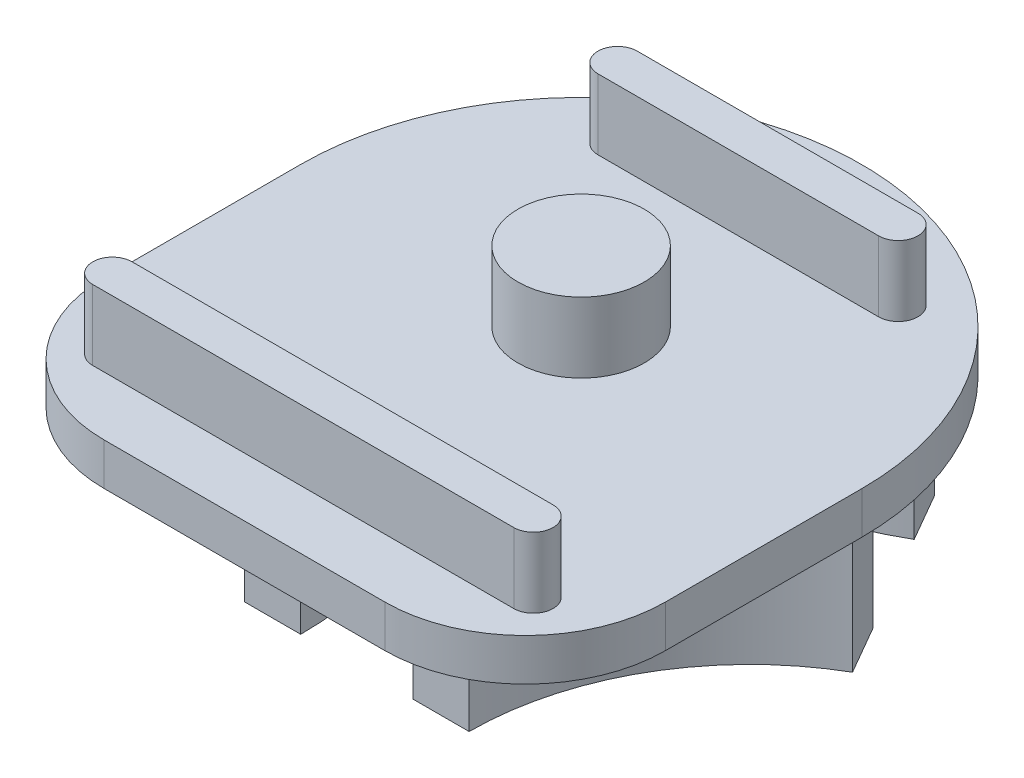
ISO-10303-21;
HEADER;
FILE_DESCRIPTION(('STEP AP214'),'2;1');
FILE_NAME('part.step','',(''),(''),'','','');
FILE_SCHEMA(('AUTOMOTIVE_DESIGN { 1 0 10303 214 1 1 1 1 }'));
ENDSEC;
DATA;
#1=APPLICATION_CONTEXT('core data for automotive mechanical design processes');
#2=APPLICATION_PROTOCOL_DEFINITION('international standard','automotive_design',2000,#1);
#3=PRODUCT_CONTEXT('',#1,'mechanical');
#4=PRODUCT('Part','Part','',(#3));
#5=PRODUCT_RELATED_PRODUCT_CATEGORY('part','',(#4));
#6=PRODUCT_DEFINITION_FORMATION('','',#4);
#7=PRODUCT_DEFINITION_CONTEXT('part definition',#1,'design');
#8=PRODUCT_DEFINITION('design','',#6,#7);
#9=PRODUCT_DEFINITION_SHAPE('','',#8);
#10=(LENGTH_UNIT() NAMED_UNIT(*) SI_UNIT(.MILLI.,.METRE.));
#11=(NAMED_UNIT(*) PLANE_ANGLE_UNIT() SI_UNIT($,.RADIAN.));
#12=(NAMED_UNIT(*) SI_UNIT($,.STERADIAN.) SOLID_ANGLE_UNIT());
#13=UNCERTAINTY_MEASURE_WITH_UNIT(LENGTH_MEASURE(1.E-05),#10,'distance_accuracy_value','');
#14=(GEOMETRIC_REPRESENTATION_CONTEXT(3) GLOBAL_UNCERTAINTY_ASSIGNED_CONTEXT((#13)) GLOBAL_UNIT_ASSIGNED_CONTEXT((#10,
#11,#12)) REPRESENTATION_CONTEXT('',''));
#15=CARTESIAN_POINT('',(0.,0.,0.));
#16=DIRECTION('',(0.,0.,1.));
#17=DIRECTION('',(1.,0.,0.));
#18=AXIS2_PLACEMENT_3D('',#15,#16,#17);
#19=CARTESIAN_POINT('',(0.,13.,32.5169500241013));
#20=DIRECTION('',(0.,1.,0.));
#21=DIRECTION('',(0.,0.,1.));
#22=AXIS2_PLACEMENT_3D('',#19,#20,#21);
#23=PLANE('',#22);
#24=CARTESIAN_POINT('',(0.,13.,32.5169500241013));
#25=DIRECTION('',(0.,1.,0.));
#26=DIRECTION('',(0.,0.,1.));
#27=AXIS2_PLACEMENT_3D('',#24,#25,#26);
#28=CIRCLE('',#27,4.5);
#29=CARTESIAN_POINT('',(0.,13.,37.0169500241013));
#30=VERTEX_POINT('',#29);
#31=EDGE_CURVE('E315',#30,#30,#28,.T.);
#32=ORIENTED_EDGE('',*,*,#31,.F.);
#33=EDGE_LOOP('',(#32));
#34=FACE_BOUND('',#33,.T.);
#35=DIRECTION('',(0.,0.,1.));
#36=VECTOR('',#35,1.);
#37=CARTESIAN_POINT('',(-20.,13.,32.5169500241013));
#38=LINE('',#37,#36);
#39=CARTESIAN_POINT('',(-20.,13.,32.5169500241013));
#40=VERTEX_POINT('',#39);
#41=CARTESIAN_POINT('',(-20.,13.,46.5059222746521));
#42=VERTEX_POINT('',#41);
#43=EDGE_CURVE('E419',#40,#42,#38,.T.);
#44=ORIENTED_EDGE('',*,*,#43,.T.);
#45=CARTESIAN_POINT('',(-10.,13.,46.5059222746521));
#46=DIRECTION('',(0.,1.,0.));
#47=DIRECTION('',(0.,0.,1.));
#48=AXIS2_PLACEMENT_3D('',#45,#46,#47);
#49=CIRCLE('',#48,10.);
#50=CARTESIAN_POINT('',(-10.,13.,56.5059222746521));
#51=VERTEX_POINT('',#50);
#52=EDGE_CURVE('E67',#42,#51,#49,.T.);
#53=ORIENTED_EDGE('',*,*,#52,.T.);
#54=DIRECTION('',(1.,0.,0.));
#55=VECTOR('',#54,1.);
#56=CARTESIAN_POINT('',(-20.,13.,56.5059222746521));
#57=LINE('',#56,#55);
#58=CARTESIAN_POINT('',(9.99999999999999,13.,56.5059222746521));
#59=VERTEX_POINT('',#58);
#60=EDGE_CURVE('E422',#51,#59,#57,.T.);
#61=ORIENTED_EDGE('',*,*,#60,.T.);
#62=CARTESIAN_POINT('',(10.,13.,46.5059222746521));
#63=DIRECTION('',(0.,1.,0.));
#64=DIRECTION('',(0.,0.,1.));
#65=AXIS2_PLACEMENT_3D('',#62,#63,#64);
#66=CIRCLE('',#65,10.);
#67=CARTESIAN_POINT('',(20.,13.,46.5059222746521));
#68=VERTEX_POINT('',#67);
#69=EDGE_CURVE('E74',#59,#68,#66,.T.);
#70=ORIENTED_EDGE('',*,*,#69,.T.);
#71=DIRECTION('',(0.,0.,-1.));
#72=VECTOR('',#71,1.);
#73=CARTESIAN_POINT('',(20.,13.,56.5059222746521));
#74=LINE('',#73,#72);
#75=CARTESIAN_POINT('',(20.,13.,32.5169500241013));
#76=VERTEX_POINT('',#75);
#77=EDGE_CURVE('E424',#68,#76,#74,.T.);
#78=ORIENTED_EDGE('',*,*,#77,.T.);
#79=CARTESIAN_POINT('',(0.,13.,32.5169500241013));
#80=DIRECTION('',(0.,1.,0.));
#81=DIRECTION('',(0.,0.,1.));
#82=AXIS2_PLACEMENT_3D('',#79,#80,#81);
#83=CIRCLE('',#82,20.);
#84=EDGE_CURVE('E416',#76,#40,#83,.T.);
#85=ORIENTED_EDGE('',*,*,#84,.T.);
#86=EDGE_LOOP('',(#44,#53,#61,#70,#78,#85));
#87=FACE_BOUND('',#86,.T.);
#88=DIRECTION('',(1.,0.,0.));
#89=VECTOR('',#88,1.);
#90=CARTESIAN_POINT('',(-10.,13.,21.3169500241013));
#91=LINE('',#90,#89);
#92=CARTESIAN_POINT('',(-10.,13.,21.3169500241013));
#93=VERTEX_POINT('',#92);
#94=CARTESIAN_POINT('',(10.,13.,21.3169500241013));
#95=VERTEX_POINT('',#94);
#96=EDGE_CURVE('E280',#93,#95,#91,.T.);
#97=ORIENTED_EDGE('',*,*,#96,.F.);
#98=CARTESIAN_POINT('',(-10.,13.,19.9169500241013));
#99=DIRECTION('',(0.,1.,0.));
#100=DIRECTION('',(0.,0.,1.));
#101=AXIS2_PLACEMENT_3D('',#98,#99,#100);
#102=CIRCLE('',#101,1.4);
#103=CARTESIAN_POINT('',(-10.,13.,18.5169500241013));
#104=VERTEX_POINT('',#103);
#105=EDGE_CURVE('E277',#104,#93,#102,.T.);
#106=ORIENTED_EDGE('',*,*,#105,.F.);
#107=DIRECTION('',(-1.,0.,0.));
#108=VECTOR('',#107,1.);
#109=CARTESIAN_POINT('',(-10.,13.,18.5169500241013));
#110=LINE('',#109,#108);
#111=CARTESIAN_POINT('',(10.,13.,18.5169500241013));
#112=VERTEX_POINT('',#111);
#113=EDGE_CURVE('E290',#112,#104,#110,.T.);
#114=ORIENTED_EDGE('',*,*,#113,.F.);
#115=CARTESIAN_POINT('',(10.,13.,19.9169500241013));
#116=DIRECTION('',(0.,1.,0.));
#117=DIRECTION('',(0.,0.,1.));
#118=AXIS2_PLACEMENT_3D('',#115,#116,#117);
#119=CIRCLE('',#118,1.4);
#120=EDGE_CURVE('E298',#95,#112,#119,.T.);
#121=ORIENTED_EDGE('',*,*,#120,.F.);
#122=EDGE_LOOP('',(#97,#106,#114,#121));
#123=FACE_BOUND('',#122,.T.);
#124=DIRECTION('',(1.,0.,0.));
#125=VECTOR('',#124,1.);
#126=CARTESIAN_POINT('',(-15.,13.,52.3169500241013));
#127=LINE('',#126,#125);
#128=CARTESIAN_POINT('',(-15.,13.,52.3169500241013));
#129=VERTEX_POINT('',#128);
#130=CARTESIAN_POINT('',(15.,13.,52.3169500241013));
#131=VERTEX_POINT('',#130);
#132=EDGE_CURVE('E889',#129,#131,#127,.T.);
#133=ORIENTED_EDGE('',*,*,#132,.F.);
#134=CARTESIAN_POINT('',(-15.,13.,50.9169500241013));
#135=DIRECTION('',(0.,1.,0.));
#136=DIRECTION('',(0.,0.,1.));
#137=AXIS2_PLACEMENT_3D('',#134,#135,#136);
#138=CIRCLE('',#137,1.39999999999999);
#139=CARTESIAN_POINT('',(-15.,13.,49.5169500241013));
#140=VERTEX_POINT('',#139);
#141=EDGE_CURVE('E275',#140,#129,#138,.T.);
#142=ORIENTED_EDGE('',*,*,#141,.F.);
#143=DIRECTION('',(-1.,0.,0.));
#144=VECTOR('',#143,1.);
#145=CARTESIAN_POINT('',(-15.,13.,49.5169500241013));
#146=LINE('',#145,#144);
#147=CARTESIAN_POINT('',(15.,13.,49.5169500241013));
#148=VERTEX_POINT('',#147);
#149=EDGE_CURVE('E271',#148,#140,#146,.T.);
#150=ORIENTED_EDGE('',*,*,#149,.F.);
#151=CARTESIAN_POINT('',(15.,13.,50.9169500241013));
#152=DIRECTION('',(0.,1.,0.));
#153=DIRECTION('',(0.,0.,1.));
#154=AXIS2_PLACEMENT_3D('',#151,#152,#153);
#155=CIRCLE('',#154,1.39999999999999);
#156=EDGE_CURVE('E886',#131,#148,#155,.T.);
#157=ORIENTED_EDGE('',*,*,#156,.F.);
#158=EDGE_LOOP('',(#133,#142,#150,#157));
#159=FACE_BOUND('',#158,.T.);
#160=ADVANCED_FACE('F59',(#34,#87,#123,#159),#23,.T.);
#161=CARTESIAN_POINT('',(-28.,10.,48.4974226119286));
#162=DIRECTION('',(0.,-1.,0.));
#163=DIRECTION('',(0.,0.,-1.));
#164=AXIS2_PLACEMENT_3D('',#161,#162,#163);
#165=CYLINDRICAL_SURFACE('',#164,20.);
#166=CARTESIAN_POINT('',(-28.,10.,48.4974226119286));
#167=DIRECTION('',(0.,1.,0.));
#168=DIRECTION('',(0.,0.,1.));
#169=AXIS2_PLACEMENT_3D('',#166,#167,#168);
#170=CIRCLE('',#169,20.);
#171=CARTESIAN_POINT('',(-7.99999999999999,10.,48.4974226119286));
#172=VERTEX_POINT('',#171);
#173=CARTESIAN_POINT('',(-18.,10.,31.1769145362398));
#174=VERTEX_POINT('',#173);
#175=EDGE_CURVE('E442',#172,#174,#170,.T.);
#176=ORIENTED_EDGE('',*,*,#175,.T.);
#177=DIRECTION('',(0.,-1.,0.));
#178=VECTOR('',#177,1.);
#179=CARTESIAN_POINT('',(-18.,10.,31.1769145362398));
#180=LINE('',#179,#178);
#181=CARTESIAN_POINT('',(-18.,0.,31.1769145362398));
#182=VERTEX_POINT('',#181);
#183=EDGE_CURVE('E365',#174,#182,#180,.T.);
#184=ORIENTED_EDGE('',*,*,#183,.T.);
#185=CARTESIAN_POINT('',(-28.,0.,48.4974226119286));
#186=DIRECTION('',(0.,1.,0.));
#187=DIRECTION('',(0.,0.,1.));
#188=AXIS2_PLACEMENT_3D('',#185,#186,#187);
#189=CIRCLE('',#188,20.);
#190=CARTESIAN_POINT('',(-7.99999999999999,0.,48.4974226119286));
#191=VERTEX_POINT('',#190);
#192=EDGE_CURVE('E441',#191,#182,#189,.T.);
#193=ORIENTED_EDGE('',*,*,#192,.F.);
#194=DIRECTION('',(0.,-1.,0.));
#195=VECTOR('',#194,1.);
#196=CARTESIAN_POINT('',(-8.,10.,48.4974226119286));
#197=LINE('',#196,#195);
#198=EDGE_CURVE('E355',#191,#172,#197,.F.);
#199=ORIENTED_EDGE('',*,*,#198,.T.);
#200=EDGE_LOOP('',(#176,#184,#193,#199));
#201=FACE_BOUND('',#200,.T.);
#202=ADVANCED_FACE('F494',(#201),#165,.F.);
#203=CARTESIAN_POINT('',(-28.,10.,48.4974226119286));
#204=DIRECTION('',(0.,-1.,0.));
#205=DIRECTION('',(0.,0.,-1.));
#206=AXIS2_PLACEMENT_3D('',#203,#204,#205);
#207=CYLINDRICAL_SURFACE('',#206,24.);
#208=DIRECTION('',(0.,-1.,0.));
#209=VECTOR('',#208,1.);
#210=CARTESIAN_POINT('',(-16.,10.,27.712812921102));
#211=LINE('',#210,#209);
#212=CARTESIAN_POINT('',(-16.,10.,27.712812921102));
#213=VERTEX_POINT('',#212);
#214=CARTESIAN_POINT('',(-16.,0.,27.712812921102));
#215=VERTEX_POINT('',#214);
#216=EDGE_CURVE('E363',#213,#215,#211,.T.);
#217=ORIENTED_EDGE('',*,*,#216,.F.);
#218=CARTESIAN_POINT('',(-28.,10.,48.4974226119286));
#219=DIRECTION('',(0.,1.,0.));
#220=DIRECTION('',(0.,0.,1.));
#221=AXIS2_PLACEMENT_3D('',#218,#219,#220);
#222=CIRCLE('',#221,24.);
#223=CARTESIAN_POINT('',(-3.99999999999999,10.,48.4974226119286));
#224=VERTEX_POINT('',#223);
#225=EDGE_CURVE('E434',#224,#213,#222,.T.);
#226=ORIENTED_EDGE('',*,*,#225,.F.);
#227=DIRECTION('',(0.,-1.,0.));
#228=VECTOR('',#227,1.);
#229=CARTESIAN_POINT('',(-4.,10.,48.4974226119286));
#230=LINE('',#229,#228);
#231=CARTESIAN_POINT('',(-3.99999999999999,0.,48.4974226119286));
#232=VERTEX_POINT('',#231);
#233=EDGE_CURVE('E353',#232,#224,#230,.F.);
#234=ORIENTED_EDGE('',*,*,#233,.F.);
#235=CARTESIAN_POINT('',(-28.,0.,48.4974226119286));
#236=DIRECTION('',(0.,1.,0.));
#237=DIRECTION('',(0.,0.,1.));
#238=AXIS2_PLACEMENT_3D('',#235,#236,#237);
#239=CIRCLE('',#238,24.);
#240=EDGE_CURVE('E445',#232,#215,#239,.T.);
#241=ORIENTED_EDGE('',*,*,#240,.T.);
#242=EDGE_LOOP('',(#217,#226,#234,#241));
#243=FACE_BOUND('',#242,.T.);
#244=ADVANCED_FACE('F500',(#243),#207,.T.);
#245=CARTESIAN_POINT('',(0.,0.,0.));
#246=DIRECTION('',(0.,1.,0.));
#247=DIRECTION('',(0.,0.,1.));
#248=AXIS2_PLACEMENT_3D('',#245,#246,#247);
#249=PLANE('',#248);
#250=DIRECTION('',(0.5,0.,-0.866025403784439));
#251=VECTOR('',#250,1.);
#252=CARTESIAN_POINT('',(-28.,0.,48.4974226119286));
#253=LINE('',#252,#251);
#254=EDGE_CURVE('E332',#182,#215,#253,.T.);
#255=ORIENTED_EDGE('',*,*,#254,.T.);
#256=ORIENTED_EDGE('',*,*,#240,.F.);
#257=DIRECTION('',(-1.,0.,0.));
#258=VECTOR('',#257,1.);
#259=CARTESIAN_POINT('',(28.,0.,48.4974226119286));
#260=LINE('',#259,#258);
#261=EDGE_CURVE('E323',#232,#191,#260,.T.);
#262=ORIENTED_EDGE('',*,*,#261,.T.);
#263=ORIENTED_EDGE('',*,*,#192,.T.);
#264=EDGE_LOOP('',(#255,#256,#262,#263));
#265=FACE_BOUND('',#264,.T.);
#266=ADVANCED_FACE('F521',(#265),#249,.F.);
#267=CARTESIAN_POINT('',(0.,10.,0.));
#268=DIRECTION('',(0.,-1.,0.));
#269=DIRECTION('',(0.,0.,-1.));
#270=AXIS2_PLACEMENT_3D('',#267,#268,#269);
#271=CYLINDRICAL_SURFACE('',#270,20.);
#272=CARTESIAN_POINT('',(0.,0.,0.));
#273=DIRECTION('',(0.,1.,0.));
#274=DIRECTION('',(0.,0.,1.));
#275=AXIS2_PLACEMENT_3D('',#272,#273,#274);
#276=CIRCLE('',#275,20.);
#277=CARTESIAN_POINT('',(-10.,0.,17.3205080756888));
#278=VERTEX_POINT('',#277);
#279=CARTESIAN_POINT('',(10.,0.,17.3205080756888));
#280=VERTEX_POINT('',#279);
#281=EDGE_CURVE('E399',#278,#280,#276,.T.);
#282=ORIENTED_EDGE('',*,*,#281,.F.);
#283=DIRECTION('',(0.,-1.,0.));
#284=VECTOR('',#283,1.);
#285=CARTESIAN_POINT('',(-10.,10.,17.3205080756888));
#286=LINE('',#285,#284);
#287=CARTESIAN_POINT('',(-10.,10.,17.3205080756888));
#288=VERTEX_POINT('',#287);
#289=EDGE_CURVE('E360',#278,#288,#286,.F.);
#290=ORIENTED_EDGE('',*,*,#289,.T.);
#291=CARTESIAN_POINT('',(0.,10.,0.));
#292=DIRECTION('',(0.,1.,0.));
#293=DIRECTION('',(0.,0.,1.));
#294=AXIS2_PLACEMENT_3D('',#291,#292,#293);
#295=CIRCLE('',#294,20.);
#296=CARTESIAN_POINT('',(9.99999999999999,10.,17.3205080756888));
#297=VERTEX_POINT('',#296);
#298=EDGE_CURVE('E404',#288,#297,#295,.T.);
#299=ORIENTED_EDGE('',*,*,#298,.T.);
#300=DIRECTION('',(0.,-1.,0.));
#301=VECTOR('',#300,1.);
#302=CARTESIAN_POINT('',(10.,10.,17.3205080756888));
#303=LINE('',#302,#301);
#304=EDGE_CURVE('E345',#297,#280,#303,.T.);
#305=ORIENTED_EDGE('',*,*,#304,.T.);
#306=EDGE_LOOP('',(#282,#290,#299,#305));
#307=FACE_BOUND('',#306,.T.);
#308=ADVANCED_FACE('F506',(#307),#271,.F.);
#309=CARTESIAN_POINT('',(0.,10.,0.));
#310=DIRECTION('',(0.,-1.,0.));
#311=DIRECTION('',(0.,0.,-1.));
#312=AXIS2_PLACEMENT_3D('',#309,#310,#311);
#313=CYLINDRICAL_SURFACE('',#312,24.);
#314=DIRECTION('',(0.,-1.,0.));
#315=VECTOR('',#314,1.);
#316=CARTESIAN_POINT('',(-12.,10.,20.7846096908265));
#317=LINE('',#316,#315);
#318=CARTESIAN_POINT('',(-12.,0.,20.7846096908265));
#319=VERTEX_POINT('',#318);
#320=CARTESIAN_POINT('',(-12.,10.,20.7846096908265));
#321=VERTEX_POINT('',#320);
#322=EDGE_CURVE('E358',#319,#321,#317,.F.);
#323=ORIENTED_EDGE('',*,*,#322,.F.);
#324=CARTESIAN_POINT('',(0.,0.,0.));
#325=DIRECTION('',(0.,1.,0.));
#326=DIRECTION('',(0.,0.,1.));
#327=AXIS2_PLACEMENT_3D('',#324,#325,#326);
#328=CIRCLE('',#327,24.);
#329=CARTESIAN_POINT('',(12.,0.,20.7846096908265));
#330=VERTEX_POINT('',#329);
#331=EDGE_CURVE('E408',#319,#330,#328,.T.);
#332=ORIENTED_EDGE('',*,*,#331,.T.);
#333=DIRECTION('',(0.,-1.,0.));
#334=VECTOR('',#333,1.);
#335=CARTESIAN_POINT('',(12.,10.,20.7846096908265));
#336=LINE('',#335,#334);
#337=CARTESIAN_POINT('',(12.,10.,20.7846096908265));
#338=VERTEX_POINT('',#337);
#339=EDGE_CURVE('E343',#338,#330,#336,.T.);
#340=ORIENTED_EDGE('',*,*,#339,.F.);
#341=CARTESIAN_POINT('',(0.,10.,0.));
#342=DIRECTION('',(0.,1.,0.));
#343=DIRECTION('',(0.,0.,1.));
#344=AXIS2_PLACEMENT_3D('',#341,#342,#343);
#345=CIRCLE('',#344,24.);
#346=EDGE_CURVE('E407',#321,#338,#345,.T.);
#347=ORIENTED_EDGE('',*,*,#346,.F.);
#348=EDGE_LOOP('',(#323,#332,#340,#347));
#349=FACE_BOUND('',#348,.T.);
#350=ADVANCED_FACE('F573',(#349),#313,.T.);
#351=CARTESIAN_POINT('',(0.,0.,0.));
#352=DIRECTION('',(0.,1.,0.));
#353=DIRECTION('',(0.,0.,1.));
#354=AXIS2_PLACEMENT_3D('',#351,#352,#353);
#355=PLANE('',#354);
#356=EDGE_CURVE('E314',#319,#278,#253,.T.);
#357=ORIENTED_EDGE('',*,*,#356,.T.);
#358=ORIENTED_EDGE('',*,*,#281,.T.);
#359=DIRECTION('',(0.5,0.,0.866025403784439));
#360=VECTOR('',#359,1.);
#361=CARTESIAN_POINT('',(0.,0.,0.));
#362=LINE('',#361,#360);
#363=EDGE_CURVE('E333',#280,#330,#362,.T.);
#364=ORIENTED_EDGE('',*,*,#363,.T.);
#365=ORIENTED_EDGE('',*,*,#331,.F.);
#366=EDGE_LOOP('',(#357,#358,#364,#365));
#367=FACE_BOUND('',#366,.T.);
#368=ADVANCED_FACE('F575',(#367),#355,.F.);
#369=CARTESIAN_POINT('',(28.,10.,48.4974226119286));
#370=DIRECTION('',(0.,-1.,0.));
#371=DIRECTION('',(0.,0.,-1.));
#372=AXIS2_PLACEMENT_3D('',#369,#370,#371);
#373=CYLINDRICAL_SURFACE('',#372,20.);
#374=CARTESIAN_POINT('',(28.,10.,48.4974226119286));
#375=DIRECTION('',(0.,1.,0.));
#376=DIRECTION('',(0.,0.,1.));
#377=AXIS2_PLACEMENT_3D('',#374,#375,#376);
#378=CIRCLE('',#377,20.);
#379=CARTESIAN_POINT('',(18.,10.,31.1769145362398));
#380=VERTEX_POINT('',#379);
#381=CARTESIAN_POINT('',(8.00000000000001,10.,48.4974226119286));
#382=VERTEX_POINT('',#381);
#383=EDGE_CURVE('E392',#380,#382,#378,.T.);
#384=ORIENTED_EDGE('',*,*,#383,.T.);
#385=DIRECTION('',(0.,-1.,0.));
#386=VECTOR('',#385,1.);
#387=CARTESIAN_POINT('',(8.,10.,48.4974226119286));
#388=LINE('',#387,#386);
#389=CARTESIAN_POINT('',(8.00000000000001,0.,48.4974226119286));
#390=VERTEX_POINT('',#389);
#391=EDGE_CURVE('E350',#382,#390,#388,.T.);
#392=ORIENTED_EDGE('',*,*,#391,.T.);
#393=CARTESIAN_POINT('',(28.,0.,48.4974226119286));
#394=DIRECTION('',(0.,1.,0.));
#395=DIRECTION('',(0.,0.,1.));
#396=AXIS2_PLACEMENT_3D('',#393,#394,#395);
#397=CIRCLE('',#396,20.);
#398=CARTESIAN_POINT('',(18.,0.,31.1769145362398));
#399=VERTEX_POINT('',#398);
#400=EDGE_CURVE('E391',#399,#390,#397,.T.);
#401=ORIENTED_EDGE('',*,*,#400,.F.);
#402=DIRECTION('',(0.,-1.,0.));
#403=VECTOR('',#402,1.);
#404=CARTESIAN_POINT('',(18.,10.,31.1769145362398));
#405=LINE('',#404,#403);
#406=EDGE_CURVE('E340',#399,#380,#405,.F.);
#407=ORIENTED_EDGE('',*,*,#406,.T.);
#408=EDGE_LOOP('',(#384,#392,#401,#407));
#409=FACE_BOUND('',#408,.T.);
#410=ADVANCED_FACE('F609',(#409),#373,.F.);
#411=CARTESIAN_POINT('',(28.,10.,48.4974226119286));
#412=DIRECTION('',(0.,-1.,0.));
#413=DIRECTION('',(0.,0.,-1.));
#414=AXIS2_PLACEMENT_3D('',#411,#412,#413);
#415=CYLINDRICAL_SURFACE('',#414,24.);
#416=DIRECTION('',(0.,-1.,0.));
#417=VECTOR('',#416,1.);
#418=CARTESIAN_POINT('',(4.00000000000002,10.,48.4974226119286));
#419=LINE('',#418,#417);
#420=CARTESIAN_POINT('',(4.00000000000002,10.,48.4974226119286));
#421=VERTEX_POINT('',#420);
#422=CARTESIAN_POINT('',(4.00000000000002,0.,48.4974226119286));
#423=VERTEX_POINT('',#422);
#424=EDGE_CURVE('E348',#421,#423,#419,.T.);
#425=ORIENTED_EDGE('',*,*,#424,.F.);
#426=CARTESIAN_POINT('',(28.,10.,48.4974226119286));
#427=DIRECTION('',(0.,1.,0.));
#428=DIRECTION('',(0.,0.,1.));
#429=AXIS2_PLACEMENT_3D('',#426,#427,#428);
#430=CIRCLE('',#429,24.);
#431=CARTESIAN_POINT('',(16.,10.,27.712812921102));
#432=VERTEX_POINT('',#431);
#433=EDGE_CURVE('E395',#432,#421,#430,.T.);
#434=ORIENTED_EDGE('',*,*,#433,.F.);
#435=DIRECTION('',(0.,-1.,0.));
#436=VECTOR('',#435,1.);
#437=CARTESIAN_POINT('',(16.,10.,27.7128129211021));
#438=LINE('',#437,#436);
#439=CARTESIAN_POINT('',(16.,0.,27.712812921102));
#440=VERTEX_POINT('',#439);
#441=EDGE_CURVE('E338',#440,#432,#438,.F.);
#442=ORIENTED_EDGE('',*,*,#441,.F.);
#443=CARTESIAN_POINT('',(28.,0.,48.4974226119286));
#444=DIRECTION('',(0.,1.,0.));
#445=DIRECTION('',(0.,0.,1.));
#446=AXIS2_PLACEMENT_3D('',#443,#444,#445);
#447=CIRCLE('',#446,24.);
#448=EDGE_CURVE('E396',#440,#423,#447,.T.);
#449=ORIENTED_EDGE('',*,*,#448,.T.);
#450=EDGE_LOOP('',(#425,#434,#442,#449));
#451=FACE_BOUND('',#450,.T.);
#452=ADVANCED_FACE('F605',(#451),#415,.T.);
#453=CARTESIAN_POINT('',(0.,0.,0.));
#454=DIRECTION('',(0.,1.,0.));
#455=DIRECTION('',(0.,0.,1.));
#456=AXIS2_PLACEMENT_3D('',#453,#454,#455);
#457=PLANE('',#456);
#458=DIRECTION('',(1.,0.,0.));
#459=VECTOR('',#458,1.);
#460=CARTESIAN_POINT('',(0.,0.,48.4974226119286));
#461=LINE('',#460,#459);
#462=EDGE_CURVE('E319',#423,#390,#461,.T.);
#463=ORIENTED_EDGE('',*,*,#462,.F.);
#464=ORIENTED_EDGE('',*,*,#448,.F.);
#465=DIRECTION('',(-0.5,0.,-0.866025403784439));
#466=VECTOR('',#465,1.);
#467=CARTESIAN_POINT('',(0.,0.,0.));
#468=LINE('',#467,#466);
#469=EDGE_CURVE('E429',#399,#440,#468,.T.);
#470=ORIENTED_EDGE('',*,*,#469,.F.);
#471=ORIENTED_EDGE('',*,*,#400,.T.);
#472=EDGE_LOOP('',(#463,#464,#470,#471));
#473=FACE_BOUND('',#472,.T.);
#474=ADVANCED_FACE('F520',(#473),#457,.F.);
#475=CARTESIAN_POINT('',(0.,13.,32.5169500241013));
#476=DIRECTION('',(0.,-1.,0.));
#477=DIRECTION('',(0.,0.,-1.));
#478=AXIS2_PLACEMENT_3D('',#475,#476,#477);
#479=CYLINDRICAL_SURFACE('',#478,20.);
#480=DIRECTION('',(0.,-1.,0.));
#481=VECTOR('',#480,1.);
#482=CARTESIAN_POINT('',(20.,13.,32.5169500241013));
#483=LINE('',#482,#481);
#484=CARTESIAN_POINT('',(20.,10.,32.5169500241013));
#485=VERTEX_POINT('',#484);
#486=EDGE_CURVE('E426',#76,#485,#483,.T.);
#487=ORIENTED_EDGE('',*,*,#486,.T.);
#488=CARTESIAN_POINT('',(0.,10.,32.5169500241013));
#489=DIRECTION('',(0.,1.,0.));
#490=DIRECTION('',(0.,0.,1.));
#491=AXIS2_PLACEMENT_3D('',#488,#489,#490);
#492=CIRCLE('',#491,20.);
#493=CARTESIAN_POINT('',(-20.,10.,32.5169500241013));
#494=VERTEX_POINT('',#493);
#495=EDGE_CURVE('E427',#485,#494,#492,.T.);
#496=ORIENTED_EDGE('',*,*,#495,.T.);
#497=DIRECTION('',(0.,-1.,0.));
#498=VECTOR('',#497,1.);
#499=CARTESIAN_POINT('',(-20.,13.,32.5169500241013));
#500=LINE('',#499,#498);
#501=EDGE_CURVE('E438',#40,#494,#500,.T.);
#502=ORIENTED_EDGE('',*,*,#501,.F.);
#503=ORIENTED_EDGE('',*,*,#84,.F.);
#504=EDGE_LOOP('',(#487,#496,#502,#503));
#505=FACE_BOUND('',#504,.T.);
#506=ADVANCED_FACE('F482',(#505),#479,.T.);
#507=CARTESIAN_POINT('',(-20.,13.,32.5169500241013));
#508=DIRECTION('',(1.,0.,0.));
#509=DIRECTION('',(0.,0.,-1.));
#510=AXIS2_PLACEMENT_3D('',#507,#508,#509);
#511=PLANE('',#510);
#512=DIRECTION('',(0.,0.,1.));
#513=VECTOR('',#512,1.);
#514=CARTESIAN_POINT('',(-20.,10.,32.5169500241013));
#515=LINE('',#514,#513);
#516=CARTESIAN_POINT('',(-20.,10.,46.5059222746521));
#517=VERTEX_POINT('',#516);
#518=EDGE_CURVE('E411',#494,#517,#515,.T.);
#519=ORIENTED_EDGE('',*,*,#518,.T.);
#520=DIRECTION('',(0.,-1.,0.));
#521=VECTOR('',#520,1.);
#522=CARTESIAN_POINT('',(-20.,13.,46.5059222746521));
#523=LINE('',#522,#521);
#524=EDGE_CURVE('E82',#517,#42,#523,.F.);
#525=ORIENTED_EDGE('',*,*,#524,.T.);
#526=ORIENTED_EDGE('',*,*,#43,.F.);
#527=ORIENTED_EDGE('',*,*,#501,.T.);
#528=EDGE_LOOP('',(#519,#525,#526,#527));
#529=FACE_BOUND('',#528,.T.);
#530=ADVANCED_FACE('F478',(#529),#511,.F.);
#531=CARTESIAN_POINT('',(-20.,13.,56.5059222746521));
#532=DIRECTION('',(0.,0.,-1.));
#533=DIRECTION('',(-1.,0.,0.));
#534=AXIS2_PLACEMENT_3D('',#531,#532,#533);
#535=PLANE('',#534);
#536=ORIENTED_EDGE('',*,*,#60,.F.);
#537=DIRECTION('',(0.,-1.,0.));
#538=VECTOR('',#537,1.);
#539=CARTESIAN_POINT('',(-10.,13.,56.5059222746521));
#540=LINE('',#539,#538);
#541=CARTESIAN_POINT('',(-10.,10.,56.5059222746521));
#542=VERTEX_POINT('',#541);
#543=EDGE_CURVE('E455',#51,#542,#540,.T.);
#544=ORIENTED_EDGE('',*,*,#543,.T.);
#545=DIRECTION('',(1.,0.,0.));
#546=VECTOR('',#545,1.);
#547=CARTESIAN_POINT('',(-20.,10.,56.5059222746521));
#548=LINE('',#547,#546);
#549=CARTESIAN_POINT('',(9.99999999999999,10.,56.5059222746521));
#550=VERTEX_POINT('',#549);
#551=EDGE_CURVE('E430',#542,#550,#548,.T.);
#552=ORIENTED_EDGE('',*,*,#551,.T.);
#553=DIRECTION('',(0.,-1.,0.));
#554=VECTOR('',#553,1.);
#555=CARTESIAN_POINT('',(9.99999999999999,13.,56.5059222746521));
#556=LINE('',#555,#554);
#557=EDGE_CURVE('E318',#550,#59,#556,.F.);
#558=ORIENTED_EDGE('',*,*,#557,.T.);
#559=EDGE_LOOP('',(#536,#544,#552,#558));
#560=FACE_BOUND('',#559,.T.);
#561=ADVANCED_FACE('F469',(#560),#535,.F.);
#562=CARTESIAN_POINT('',(20.,13.,56.5059222746521));
#563=DIRECTION('',(-1.,0.,0.));
#564=DIRECTION('',(0.,0.,1.));
#565=AXIS2_PLACEMENT_3D('',#562,#563,#564);
#566=PLANE('',#565);
#567=ORIENTED_EDGE('',*,*,#77,.F.);
#568=DIRECTION('',(0.,-1.,0.));
#569=VECTOR('',#568,1.);
#570=CARTESIAN_POINT('',(20.,13.,46.5059222746521));
#571=LINE('',#570,#569);
#572=CARTESIAN_POINT('',(20.,10.,46.5059222746521));
#573=VERTEX_POINT('',#572);
#574=EDGE_CURVE('E12',#68,#573,#571,.T.);
#575=ORIENTED_EDGE('',*,*,#574,.T.);
#576=DIRECTION('',(0.,0.,-1.));
#577=VECTOR('',#576,1.);
#578=CARTESIAN_POINT('',(20.,10.,56.5059222746521));
#579=LINE('',#578,#577);
#580=EDGE_CURVE('E420',#573,#485,#579,.T.);
#581=ORIENTED_EDGE('',*,*,#580,.T.);
#582=ORIENTED_EDGE('',*,*,#486,.F.);
#583=EDGE_LOOP('',(#567,#575,#581,#582));
#584=FACE_BOUND('',#583,.T.);
#585=ADVANCED_FACE('F486',(#584),#566,.F.);
#586=CARTESIAN_POINT('',(0.,10.,32.5169500241013));
#587=DIRECTION('',(0.,1.,0.));
#588=DIRECTION('',(0.,0.,1.));
#589=AXIS2_PLACEMENT_3D('',#586,#587,#588);
#590=PLANE('',#589);
#591=ORIENTED_EDGE('',*,*,#225,.T.);
#592=DIRECTION('',(0.5,0.,-0.866025403784439));
#593=VECTOR('',#592,1.);
#594=CARTESIAN_POINT('',(-28.,10.,48.4974226119286));
#595=LINE('',#594,#593);
#596=EDGE_CURVE('E322',#174,#213,#595,.T.);
#597=ORIENTED_EDGE('',*,*,#596,.F.);
#598=ORIENTED_EDGE('',*,*,#175,.F.);
#599=DIRECTION('',(-1.,0.,0.));
#600=VECTOR('',#599,1.);
#601=CARTESIAN_POINT('',(28.,10.,48.4974226119286));
#602=LINE('',#601,#600);
#603=EDGE_CURVE('E327',#224,#172,#602,.T.);
#604=ORIENTED_EDGE('',*,*,#603,.F.);
#605=EDGE_LOOP('',(#591,#597,#598,#604));
#606=FACE_BOUND('',#605,.T.);
#607=ORIENTED_EDGE('',*,*,#433,.T.);
#608=EDGE_CURVE('E329',#382,#421,#602,.T.);
#609=ORIENTED_EDGE('',*,*,#608,.F.);
#610=ORIENTED_EDGE('',*,*,#383,.F.);
#611=DIRECTION('',(0.5,0.,0.866025403784439));
#612=VECTOR('',#611,1.);
#613=CARTESIAN_POINT('',(0.,10.,0.));
#614=LINE('',#613,#612);
#615=EDGE_CURVE('E324',#432,#380,#614,.T.);
#616=ORIENTED_EDGE('',*,*,#615,.F.);
#617=EDGE_LOOP('',(#607,#609,#610,#616));
#618=FACE_BOUND('',#617,.T.);
#619=ORIENTED_EDGE('',*,*,#551,.F.);
#620=CARTESIAN_POINT('',(-10.,10.,46.5059222746521));
#621=DIRECTION('',(0.,1.,0.));
#622=DIRECTION('',(0.,0.,1.));
#623=AXIS2_PLACEMENT_3D('',#620,#621,#622);
#624=CIRCLE('',#623,10.);
#625=EDGE_CURVE('E460',#542,#517,#624,.F.);
#626=ORIENTED_EDGE('',*,*,#625,.T.);
#627=ORIENTED_EDGE('',*,*,#518,.F.);
#628=ORIENTED_EDGE('',*,*,#495,.F.);
#629=ORIENTED_EDGE('',*,*,#580,.F.);
#630=CARTESIAN_POINT('',(10.,10.,46.5059222746521));
#631=DIRECTION('',(0.,1.,0.));
#632=DIRECTION('',(0.,0.,1.));
#633=AXIS2_PLACEMENT_3D('',#630,#631,#632);
#634=CIRCLE('',#633,10.);
#635=EDGE_CURVE('E458',#573,#550,#634,.F.);
#636=ORIENTED_EDGE('',*,*,#635,.T.);
#637=EDGE_LOOP('',(#619,#626,#627,#628,#629,#636));
#638=FACE_BOUND('',#637,.T.);
#639=EDGE_CURVE('E320',#321,#288,#595,.T.);
#640=ORIENTED_EDGE('',*,*,#639,.F.);
#641=ORIENTED_EDGE('',*,*,#346,.T.);
#642=EDGE_CURVE('E326',#297,#338,#614,.T.);
#643=ORIENTED_EDGE('',*,*,#642,.F.);
#644=ORIENTED_EDGE('',*,*,#298,.F.);
#645=EDGE_LOOP('',(#640,#641,#643,#644));
#646=FACE_BOUND('',#645,.T.);
#647=CARTESIAN_POINT('',(-28.,10.,48.4974226119286));
#648=DIRECTION('',(0.,1.,0.));
#649=DIRECTION('',(0.,0.,1.));
#650=AXIS2_PLACEMENT_3D('',#647,#648,#649);
#651=CIRCLE('',#650,30.);
#652=CARTESIAN_POINT('',(0.,10.,37.7270929976596));
#653=VERTEX_POINT('',#652);
#654=CARTESIAN_POINT('',(-4.6726209469112,10.,29.6338761130988));
#655=VERTEX_POINT('',#654);
#656=EDGE_CURVE('E375',#653,#655,#651,.T.);
#657=ORIENTED_EDGE('',*,*,#656,.F.);
#658=CARTESIAN_POINT('',(28.,10.,48.4974226119286));
#659=DIRECTION('',(0.,1.,0.));
#660=DIRECTION('',(0.,0.,1.));
#661=AXIS2_PLACEMENT_3D('',#658,#659,#660);
#662=CIRCLE('',#661,30.);
#663=CARTESIAN_POINT('',(4.67262094691122,10.,29.6338761130988));
#664=VERTEX_POINT('',#663);
#665=EDGE_CURVE('E369',#664,#653,#662,.T.);
#666=ORIENTED_EDGE('',*,*,#665,.F.);
#667=CARTESIAN_POINT('',(0.,10.,0.));
#668=DIRECTION('',(0.,1.,0.));
#669=DIRECTION('',(0.,0.,1.));
#670=AXIS2_PLACEMENT_3D('',#667,#668,#669);
#671=CIRCLE('',#670,30.);
#672=EDGE_CURVE('E371',#655,#664,#671,.T.);
#673=ORIENTED_EDGE('',*,*,#672,.F.);
#674=EDGE_LOOP('',(#657,#666,#673));
#675=FACE_BOUND('',#674,.T.);
#676=ADVANCED_FACE('F475',(#606,#618,#638,#646,#675),#590,.F.);
#677=CARTESIAN_POINT('',(28.,10.,48.4974226119286));
#678=DIRECTION('',(0.,-1.,0.));
#679=DIRECTION('',(0.,0.,-1.));
#680=AXIS2_PLACEMENT_3D('',#677,#678,#679);
#681=CYLINDRICAL_SURFACE('',#680,30.);
#682=CARTESIAN_POINT('',(28.,0.,48.4974226119286));
#683=DIRECTION('',(0.,1.,0.));
#684=DIRECTION('',(0.,0.,1.));
#685=AXIS2_PLACEMENT_3D('',#682,#683,#684);
#686=CIRCLE('',#685,30.);
#687=CARTESIAN_POINT('',(4.67262094691122,0.,29.6338761130988));
#688=VERTEX_POINT('',#687);
#689=CARTESIAN_POINT('',(0.,0.,37.7270929976596));
#690=VERTEX_POINT('',#689);
#691=EDGE_CURVE('E368',#688,#690,#686,.T.);
#692=ORIENTED_EDGE('',*,*,#691,.F.);
#693=DIRECTION('',(0.,-1.,0.));
#694=VECTOR('',#693,1.);
#695=CARTESIAN_POINT('',(4.67262094691122,10.,29.6338761130988));
#696=LINE('',#695,#694);
#697=EDGE_CURVE('E389',#664,#688,#696,.T.);
#698=ORIENTED_EDGE('',*,*,#697,.F.);
#699=ORIENTED_EDGE('',*,*,#665,.T.);
#700=DIRECTION('',(0.,-1.,0.));
#701=VECTOR('',#700,1.);
#702=CARTESIAN_POINT('',(0.,10.,37.7270929976596));
#703=LINE('',#702,#701);
#704=EDGE_CURVE('E378',#653,#690,#703,.T.);
#705=ORIENTED_EDGE('',*,*,#704,.T.);
#706=EDGE_LOOP('',(#692,#698,#699,#705));
#707=FACE_BOUND('',#706,.T.);
#708=ADVANCED_FACE('F510',(#707),#681,.F.);
#709=CARTESIAN_POINT('',(0.,10.,0.));
#710=DIRECTION('',(0.,-1.,0.));
#711=DIRECTION('',(0.,0.,-1.));
#712=AXIS2_PLACEMENT_3D('',#709,#710,#711);
#713=CYLINDRICAL_SURFACE('',#712,30.);
#714=CARTESIAN_POINT('',(0.,0.,0.));
#715=DIRECTION('',(0.,1.,0.));
#716=DIRECTION('',(0.,0.,1.));
#717=AXIS2_PLACEMENT_3D('',#714,#715,#716);
#718=CIRCLE('',#717,30.);
#719=CARTESIAN_POINT('',(-4.6726209469112,0.,29.6338761130988));
#720=VERTEX_POINT('',#719);
#721=EDGE_CURVE('E381',#720,#688,#718,.T.);
#722=ORIENTED_EDGE('',*,*,#721,.F.);
#723=DIRECTION('',(0.,-1.,0.));
#724=VECTOR('',#723,1.);
#725=CARTESIAN_POINT('',(-4.6726209469112,10.,29.6338761130988));
#726=LINE('',#725,#724);
#727=EDGE_CURVE('E387',#655,#720,#726,.T.);
#728=ORIENTED_EDGE('',*,*,#727,.F.);
#729=ORIENTED_EDGE('',*,*,#672,.T.);
#730=ORIENTED_EDGE('',*,*,#697,.T.);
#731=EDGE_LOOP('',(#722,#728,#729,#730));
#732=FACE_BOUND('',#731,.T.);
#733=ADVANCED_FACE('F593',(#732),#713,.F.);
#734=CARTESIAN_POINT('',(-28.,10.,48.4974226119286));
#735=DIRECTION('',(0.,-1.,0.));
#736=DIRECTION('',(0.,0.,-1.));
#737=AXIS2_PLACEMENT_3D('',#734,#735,#736);
#738=CYLINDRICAL_SURFACE('',#737,30.);
#739=CARTESIAN_POINT('',(-28.,0.,48.4974226119286));
#740=DIRECTION('',(0.,1.,0.));
#741=DIRECTION('',(0.,0.,1.));
#742=AXIS2_PLACEMENT_3D('',#739,#740,#741);
#743=CIRCLE('',#742,30.);
#744=EDGE_CURVE('E372',#690,#720,#743,.T.);
#745=ORIENTED_EDGE('',*,*,#744,.F.);
#746=ORIENTED_EDGE('',*,*,#704,.F.);
#747=ORIENTED_EDGE('',*,*,#656,.T.);
#748=ORIENTED_EDGE('',*,*,#727,.T.);
#749=EDGE_LOOP('',(#745,#746,#747,#748));
#750=FACE_BOUND('',#749,.T.);
#751=ADVANCED_FACE('F586',(#750),#738,.F.);
#752=CARTESIAN_POINT('',(0.,0.,0.));
#753=DIRECTION('',(0.,1.,0.));
#754=DIRECTION('',(0.,0.,1.));
#755=AXIS2_PLACEMENT_3D('',#752,#753,#754);
#756=PLANE('',#755);
#757=ORIENTED_EDGE('',*,*,#691,.T.);
#758=ORIENTED_EDGE('',*,*,#744,.T.);
#759=ORIENTED_EDGE('',*,*,#721,.T.);
#760=EDGE_LOOP('',(#757,#758,#759));
#761=FACE_BOUND('',#760,.T.);
#762=ADVANCED_FACE('F591',(#761),#756,.F.);
#763=CARTESIAN_POINT('',(0.,10.,0.));
#764=DIRECTION('',(0.866025403784439,0.,-0.5));
#765=DIRECTION('',(-0.5,0.,-0.866025403784439));
#766=AXIS2_PLACEMENT_3D('',#763,#764,#765);
#767=PLANE('',#766);
#768=ORIENTED_EDGE('',*,*,#469,.T.);
#769=ORIENTED_EDGE('',*,*,#441,.T.);
#770=ORIENTED_EDGE('',*,*,#615,.T.);
#771=ORIENTED_EDGE('',*,*,#406,.F.);
#772=EDGE_LOOP('',(#768,#769,#770,#771));
#773=FACE_BOUND('',#772,.T.);
#774=ADVANCED_FACE('F565',(#773),#767,.T.);
#775=CARTESIAN_POINT('',(28.,10.,48.4974226119286));
#776=DIRECTION('',(0.,0.,1.));
#777=DIRECTION('',(1.,0.,0.));
#778=AXIS2_PLACEMENT_3D('',#775,#776,#777);
#779=PLANE('',#778);
#780=ORIENTED_EDGE('',*,*,#608,.T.);
#781=ORIENTED_EDGE('',*,*,#424,.T.);
#782=ORIENTED_EDGE('',*,*,#462,.T.);
#783=ORIENTED_EDGE('',*,*,#391,.F.);
#784=EDGE_LOOP('',(#780,#781,#782,#783));
#785=FACE_BOUND('',#784,.T.);
#786=ADVANCED_FACE('F555',(#785),#779,.T.);
#787=ORIENTED_EDGE('',*,*,#642,.T.);
#788=ORIENTED_EDGE('',*,*,#339,.T.);
#789=ORIENTED_EDGE('',*,*,#363,.F.);
#790=ORIENTED_EDGE('',*,*,#304,.F.);
#791=EDGE_LOOP('',(#787,#788,#789,#790));
#792=FACE_BOUND('',#791,.T.);
#793=ADVANCED_FACE('F559',(#792),#767,.T.);
#794=CARTESIAN_POINT('',(-28.,10.,48.4974226119286));
#795=DIRECTION('',(-0.866025403784439,0.,-0.5));
#796=DIRECTION('',(-0.5,0.,0.866025403784439));
#797=AXIS2_PLACEMENT_3D('',#794,#795,#796);
#798=PLANE('',#797);
#799=ORIENTED_EDGE('',*,*,#356,.F.);
#800=ORIENTED_EDGE('',*,*,#322,.T.);
#801=ORIENTED_EDGE('',*,*,#639,.T.);
#802=ORIENTED_EDGE('',*,*,#289,.F.);
#803=EDGE_LOOP('',(#799,#800,#801,#802));
#804=FACE_BOUND('',#803,.T.);
#805=ADVANCED_FACE('F546',(#804),#798,.T.);
#806=ORIENTED_EDGE('',*,*,#261,.F.);
#807=ORIENTED_EDGE('',*,*,#233,.T.);
#808=ORIENTED_EDGE('',*,*,#603,.T.);
#809=ORIENTED_EDGE('',*,*,#198,.F.);
#810=EDGE_LOOP('',(#806,#807,#808,#809));
#811=FACE_BOUND('',#810,.T.);
#812=ADVANCED_FACE('F540',(#811),#779,.T.);
#813=ORIENTED_EDGE('',*,*,#596,.T.);
#814=ORIENTED_EDGE('',*,*,#216,.T.);
#815=ORIENTED_EDGE('',*,*,#254,.F.);
#816=ORIENTED_EDGE('',*,*,#183,.F.);
#817=EDGE_LOOP('',(#813,#814,#815,#816));
#818=FACE_BOUND('',#817,.T.);
#819=ADVANCED_FACE('F542',(#818),#798,.T.);
#820=CARTESIAN_POINT('',(0.,18.,32.5169500241013));
#821=DIRECTION('',(0.,-1.,0.));
#822=DIRECTION('',(0.,0.,-1.));
#823=AXIS2_PLACEMENT_3D('',#820,#821,#822);
#824=CYLINDRICAL_SURFACE('',#823,4.5);
#825=CARTESIAN_POINT('',(0.,18.,32.5169500241013));
#826=DIRECTION('',(0.,1.,0.));
#827=DIRECTION('',(0.,0.,1.));
#828=AXIS2_PLACEMENT_3D('',#825,#826,#827);
#829=CIRCLE('',#828,4.5);
#830=CARTESIAN_POINT('',(0.,18.,37.0169500241013));
#831=VERTEX_POINT('',#830);
#832=EDGE_CURVE('E311',#831,#831,#829,.T.);
#833=ORIENTED_EDGE('',*,*,#832,.F.);
#834=EDGE_LOOP('',(#833));
#835=FACE_BOUND('',#834,.T.);
#836=ORIENTED_EDGE('',*,*,#31,.T.);
#837=EDGE_LOOP('',(#836));
#838=FACE_BOUND('',#837,.T.);
#839=ADVANCED_FACE('F544',(#835,#838),#824,.T.);
#840=CARTESIAN_POINT('',(0.,18.,32.5169500241013));
#841=DIRECTION('',(0.,1.,0.));
#842=DIRECTION('',(0.,0.,1.));
#843=AXIS2_PLACEMENT_3D('',#840,#841,#842);
#844=PLANE('',#843);
#845=ORIENTED_EDGE('',*,*,#832,.T.);
#846=EDGE_LOOP('',(#845));
#847=FACE_BOUND('',#846,.T.);
#848=ADVANCED_FACE('F551',(#847),#844,.T.);
#849=CARTESIAN_POINT('',(-10.,18.,19.9169500241013));
#850=DIRECTION('',(0.,-1.,0.));
#851=DIRECTION('',(0.,0.,-1.));
#852=AXIS2_PLACEMENT_3D('',#849,#850,#851);
#853=CYLINDRICAL_SURFACE('',#852,1.4);
#854=ORIENTED_EDGE('',*,*,#105,.T.);
#855=DIRECTION('',(0.,-1.,0.));
#856=VECTOR('',#855,1.);
#857=CARTESIAN_POINT('',(-10.,18.,21.3169500241013));
#858=LINE('',#857,#856);
#859=CARTESIAN_POINT('',(-10.,18.,21.3169500241013));
#860=VERTEX_POINT('',#859);
#861=EDGE_CURVE('E309',#860,#93,#858,.T.);
#862=ORIENTED_EDGE('',*,*,#861,.F.);
#863=CARTESIAN_POINT('',(-10.,18.,19.9169500241013));
#864=DIRECTION('',(0.,1.,0.));
#865=DIRECTION('',(0.,0.,1.));
#866=AXIS2_PLACEMENT_3D('',#863,#864,#865);
#867=CIRCLE('',#866,1.4);
#868=CARTESIAN_POINT('',(-10.,18.,18.5169500241013));
#869=VERTEX_POINT('',#868);
#870=EDGE_CURVE('E286',#869,#860,#867,.T.);
#871=ORIENTED_EDGE('',*,*,#870,.F.);
#872=DIRECTION('',(0.,-1.,0.));
#873=VECTOR('',#872,1.);
#874=CARTESIAN_POINT('',(-10.,18.,18.5169500241013));
#875=LINE('',#874,#873);
#876=EDGE_CURVE('E295',#869,#104,#875,.T.);
#877=ORIENTED_EDGE('',*,*,#876,.T.);
#878=EDGE_LOOP('',(#854,#862,#871,#877));
#879=FACE_BOUND('',#878,.T.);
#880=ADVANCED_FACE('F774',(#879),#853,.T.);
#881=CARTESIAN_POINT('',(-10.,18.,21.3169500241013));
#882=DIRECTION('',(0.,0.,-1.));
#883=DIRECTION('',(-1.,0.,0.));
#884=AXIS2_PLACEMENT_3D('',#881,#882,#883);
#885=PLANE('',#884);
#886=ORIENTED_EDGE('',*,*,#96,.T.);
#887=DIRECTION('',(0.,-1.,0.));
#888=VECTOR('',#887,1.);
#889=CARTESIAN_POINT('',(10.,18.,21.3169500241013));
#890=LINE('',#889,#888);
#891=CARTESIAN_POINT('',(10.,18.,21.3169500241013));
#892=VERTEX_POINT('',#891);
#893=EDGE_CURVE('E306',#892,#95,#890,.T.);
#894=ORIENTED_EDGE('',*,*,#893,.F.);
#895=DIRECTION('',(1.,0.,0.));
#896=VECTOR('',#895,1.);
#897=CARTESIAN_POINT('',(-10.,18.,21.3169500241013));
#898=LINE('',#897,#896);
#899=EDGE_CURVE('E289',#860,#892,#898,.T.);
#900=ORIENTED_EDGE('',*,*,#899,.F.);
#901=ORIENTED_EDGE('',*,*,#861,.T.);
#902=EDGE_LOOP('',(#886,#894,#900,#901));
#903=FACE_BOUND('',#902,.T.);
#904=ADVANCED_FACE('F783',(#903),#885,.F.);
#905=CARTESIAN_POINT('',(10.,18.,19.9169500241013));
#906=DIRECTION('',(0.,-1.,0.));
#907=DIRECTION('',(0.,0.,-1.));
#908=AXIS2_PLACEMENT_3D('',#905,#906,#907);
#909=CYLINDRICAL_SURFACE('',#908,1.4);
#910=ORIENTED_EDGE('',*,*,#120,.T.);
#911=DIRECTION('',(0.,-1.,0.));
#912=VECTOR('',#911,1.);
#913=CARTESIAN_POINT('',(10.,18.,18.5169500241013));
#914=LINE('',#913,#912);
#915=CARTESIAN_POINT('',(10.,18.,18.5169500241013));
#916=VERTEX_POINT('',#915);
#917=EDGE_CURVE('E304',#916,#112,#914,.T.);
#918=ORIENTED_EDGE('',*,*,#917,.F.);
#919=CARTESIAN_POINT('',(10.,18.,19.9169500241013));
#920=DIRECTION('',(0.,1.,0.));
#921=DIRECTION('',(0.,0.,1.));
#922=AXIS2_PLACEMENT_3D('',#919,#920,#921);
#923=CIRCLE('',#922,1.4);
#924=EDGE_CURVE('E292',#892,#916,#923,.T.);
#925=ORIENTED_EDGE('',*,*,#924,.F.);
#926=ORIENTED_EDGE('',*,*,#893,.T.);
#927=EDGE_LOOP('',(#910,#918,#925,#926));
#928=FACE_BOUND('',#927,.T.);
#929=ADVANCED_FACE('F792',(#928),#909,.T.);
#930=CARTESIAN_POINT('',(-10.,18.,18.5169500241013));
#931=DIRECTION('',(0.,0.,1.));
#932=DIRECTION('',(1.,0.,0.));
#933=AXIS2_PLACEMENT_3D('',#930,#931,#932);
#934=PLANE('',#933);
#935=ORIENTED_EDGE('',*,*,#113,.T.);
#936=ORIENTED_EDGE('',*,*,#876,.F.);
#937=DIRECTION('',(-1.,0.,0.));
#938=VECTOR('',#937,1.);
#939=CARTESIAN_POINT('',(-10.,18.,18.5169500241013));
#940=LINE('',#939,#938);
#941=EDGE_CURVE('E294',#916,#869,#940,.T.);
#942=ORIENTED_EDGE('',*,*,#941,.F.);
#943=ORIENTED_EDGE('',*,*,#917,.T.);
#944=EDGE_LOOP('',(#935,#936,#942,#943));
#945=FACE_BOUND('',#944,.T.);
#946=ADVANCED_FACE('F801',(#945),#934,.F.);
#947=CARTESIAN_POINT('',(-10.,18.,19.9169500241013));
#948=DIRECTION('',(0.,1.,0.));
#949=DIRECTION('',(0.,0.,1.));
#950=AXIS2_PLACEMENT_3D('',#947,#948,#949);
#951=PLANE('',#950);
#952=ORIENTED_EDGE('',*,*,#870,.T.);
#953=ORIENTED_EDGE('',*,*,#899,.T.);
#954=ORIENTED_EDGE('',*,*,#924,.T.);
#955=ORIENTED_EDGE('',*,*,#941,.T.);
#956=EDGE_LOOP('',(#952,#953,#954,#955));
#957=FACE_BOUND('',#956,.T.);
#958=ADVANCED_FACE('F810',(#957),#951,.T.);
#959=CARTESIAN_POINT('',(-15.,18.,50.9169500241013));
#960=DIRECTION('',(0.,-1.,0.));
#961=DIRECTION('',(0.,0.,-1.));
#962=AXIS2_PLACEMENT_3D('',#959,#960,#961);
#963=CYLINDRICAL_SURFACE('',#962,1.39999999999999);
#964=ORIENTED_EDGE('',*,*,#141,.T.);
#965=DIRECTION('',(0.,-1.,0.));
#966=VECTOR('',#965,1.);
#967=CARTESIAN_POINT('',(-15.,18.,52.3169500241013));
#968=LINE('',#967,#966);
#969=CARTESIAN_POINT('',(-15.,18.,52.3169500241013));
#970=VERTEX_POINT('',#969);
#971=EDGE_CURVE('E255',#970,#129,#968,.T.);
#972=ORIENTED_EDGE('',*,*,#971,.F.);
#973=CARTESIAN_POINT('',(-15.,18.,50.9169500241013));
#974=DIRECTION('',(0.,1.,0.));
#975=DIRECTION('',(0.,0.,1.));
#976=AXIS2_PLACEMENT_3D('',#973,#974,#975);
#977=CIRCLE('',#976,1.39999999999999);
#978=CARTESIAN_POINT('',(-15.,18.,49.5169500241013));
#979=VERTEX_POINT('',#978);
#980=EDGE_CURVE('E262',#979,#970,#977,.T.);
#981=ORIENTED_EDGE('',*,*,#980,.F.);
#982=DIRECTION('',(0.,-1.,0.));
#983=VECTOR('',#982,1.);
#984=CARTESIAN_POINT('',(-15.,18.,49.5169500241013));
#985=LINE('',#984,#983);
#986=EDGE_CURVE('E881',#979,#140,#985,.T.);
#987=ORIENTED_EDGE('',*,*,#986,.T.);
#988=EDGE_LOOP('',(#964,#972,#981,#987));
#989=FACE_BOUND('',#988,.T.);
#990=ADVANCED_FACE('F273',(#989),#963,.T.);
#991=CARTESIAN_POINT('',(-15.,18.,52.3169500241013));
#992=DIRECTION('',(0.,0.,-1.));
#993=DIRECTION('',(-1.,0.,0.));
#994=AXIS2_PLACEMENT_3D('',#991,#992,#993);
#995=PLANE('',#994);
#996=ORIENTED_EDGE('',*,*,#132,.T.);
#997=DIRECTION('',(0.,-1.,0.));
#998=VECTOR('',#997,1.);
#999=CARTESIAN_POINT('',(15.,18.,52.3169500241013));
#1000=LINE('',#999,#998);
#1001=CARTESIAN_POINT('',(15.,18.,52.3169500241013));
#1002=VERTEX_POINT('',#1001);
#1003=EDGE_CURVE('E258',#1002,#131,#1000,.T.);
#1004=ORIENTED_EDGE('',*,*,#1003,.F.);
#1005=DIRECTION('',(1.,0.,0.));
#1006=VECTOR('',#1005,1.);
#1007=CARTESIAN_POINT('',(-15.,18.,52.3169500241013));
#1008=LINE('',#1007,#1006);
#1009=EDGE_CURVE('E251',#970,#1002,#1008,.T.);
#1010=ORIENTED_EDGE('',*,*,#1009,.F.);
#1011=ORIENTED_EDGE('',*,*,#971,.T.);
#1012=EDGE_LOOP('',(#996,#1004,#1010,#1011));
#1013=FACE_BOUND('',#1012,.T.);
#1014=ADVANCED_FACE('F253',(#1013),#995,.F.);
#1015=CARTESIAN_POINT('',(15.,18.,50.9169500241013));
#1016=DIRECTION('',(0.,-1.,0.));
#1017=DIRECTION('',(0.,0.,-1.));
#1018=AXIS2_PLACEMENT_3D('',#1015,#1016,#1017);
#1019=CYLINDRICAL_SURFACE('',#1018,1.39999999999999);
#1020=ORIENTED_EDGE('',*,*,#156,.T.);
#1021=DIRECTION('',(0.,-1.,0.));
#1022=VECTOR('',#1021,1.);
#1023=CARTESIAN_POINT('',(15.,18.,49.5169500241013));
#1024=LINE('',#1023,#1022);
#1025=CARTESIAN_POINT('',(15.,18.,49.5169500241013));
#1026=VERTEX_POINT('',#1025);
#1027=EDGE_CURVE('E282',#1026,#148,#1024,.T.);
#1028=ORIENTED_EDGE('',*,*,#1027,.F.);
#1029=CARTESIAN_POINT('',(15.,18.,50.9169500241013));
#1030=DIRECTION('',(0.,1.,0.));
#1031=DIRECTION('',(0.,0.,1.));
#1032=AXIS2_PLACEMENT_3D('',#1029,#1030,#1031);
#1033=CIRCLE('',#1032,1.39999999999999);
#1034=EDGE_CURVE('E261',#1002,#1026,#1033,.T.);
#1035=ORIENTED_EDGE('',*,*,#1034,.F.);
#1036=ORIENTED_EDGE('',*,*,#1003,.T.);
#1037=EDGE_LOOP('',(#1020,#1028,#1035,#1036));
#1038=FACE_BOUND('',#1037,.T.);
#1039=ADVANCED_FACE('F834',(#1038),#1019,.T.);
#1040=CARTESIAN_POINT('',(-15.,18.,49.5169500241013));
#1041=DIRECTION('',(0.,0.,1.));
#1042=DIRECTION('',(1.,0.,0.));
#1043=AXIS2_PLACEMENT_3D('',#1040,#1041,#1042);
#1044=PLANE('',#1043);
#1045=ORIENTED_EDGE('',*,*,#149,.T.);
#1046=ORIENTED_EDGE('',*,*,#986,.F.);
#1047=DIRECTION('',(-1.,0.,0.));
#1048=VECTOR('',#1047,1.);
#1049=CARTESIAN_POINT('',(-15.,18.,49.5169500241013));
#1050=LINE('',#1049,#1048);
#1051=EDGE_CURVE('E267',#1026,#979,#1050,.T.);
#1052=ORIENTED_EDGE('',*,*,#1051,.F.);
#1053=ORIENTED_EDGE('',*,*,#1027,.T.);
#1054=EDGE_LOOP('',(#1045,#1046,#1052,#1053));
#1055=FACE_BOUND('',#1054,.T.);
#1056=ADVANCED_FACE('F842',(#1055),#1044,.F.);
#1057=CARTESIAN_POINT('',(-15.,18.,50.9169500241013));
#1058=DIRECTION('',(0.,1.,0.));
#1059=DIRECTION('',(0.,0.,1.));
#1060=AXIS2_PLACEMENT_3D('',#1057,#1058,#1059);
#1061=PLANE('',#1060);
#1062=ORIENTED_EDGE('',*,*,#980,.T.);
#1063=ORIENTED_EDGE('',*,*,#1009,.T.);
#1064=ORIENTED_EDGE('',*,*,#1034,.T.);
#1065=ORIENTED_EDGE('',*,*,#1051,.T.);
#1066=EDGE_LOOP('',(#1062,#1063,#1064,#1065));
#1067=FACE_BOUND('',#1066,.T.);
#1068=ADVANCED_FACE('F265',(#1067),#1061,.T.);
#1069=CARTESIAN_POINT('',(-10.,13.,46.5059222746521));
#1070=DIRECTION('',(0.,-1.,0.));
#1071=DIRECTION('',(0.,0.,-1.));
#1072=AXIS2_PLACEMENT_3D('',#1069,#1070,#1071);
#1073=CYLINDRICAL_SURFACE('',#1072,10.);
#1074=ORIENTED_EDGE('',*,*,#52,.F.);
#1075=ORIENTED_EDGE('',*,*,#524,.F.);
#1076=ORIENTED_EDGE('',*,*,#625,.F.);
#1077=ORIENTED_EDGE('',*,*,#543,.F.);
#1078=EDGE_LOOP('',(#1074,#1075,#1076,#1077));
#1079=FACE_BOUND('',#1078,.T.);
#1080=ADVANCED_FACE('F472',(#1079),#1073,.T.);
#1081=CARTESIAN_POINT('',(10.,13.,46.5059222746521));
#1082=DIRECTION('',(0.,-1.,0.));
#1083=DIRECTION('',(0.,0.,-1.));
#1084=AXIS2_PLACEMENT_3D('',#1081,#1082,#1083);
#1085=CYLINDRICAL_SURFACE('',#1084,10.);
#1086=ORIENTED_EDGE('',*,*,#69,.F.);
#1087=ORIENTED_EDGE('',*,*,#557,.F.);
#1088=ORIENTED_EDGE('',*,*,#635,.F.);
#1089=ORIENTED_EDGE('',*,*,#574,.F.);
#1090=EDGE_LOOP('',(#1086,#1087,#1088,#1089));
#1091=FACE_BOUND('',#1090,.T.);
#1092=ADVANCED_FACE('F61',(#1091),#1085,.T.);
#1093=CLOSED_SHELL('',(#160,#202,#244,#266,#308,#350,#368,#410,#452,#474,#506,#530,#561,#585,
#676,#708,#733,#751,#762,#774,#786,#793,#805,#812,#819,#839,#848,#880,#904,#929,#946,#958,#990,
#1014,#1039,#1056,#1068,#1080,#1092));
#1094=MANIFOLD_SOLID_BREP('B2',#1093);
#1095=ADVANCED_BREP_SHAPE_REPRESENTATION('',(#18,#1094),#14);
#1096=SHAPE_DEFINITION_REPRESENTATION(#9,#1095);
ENDSEC;
END-ISO-10303-21;
